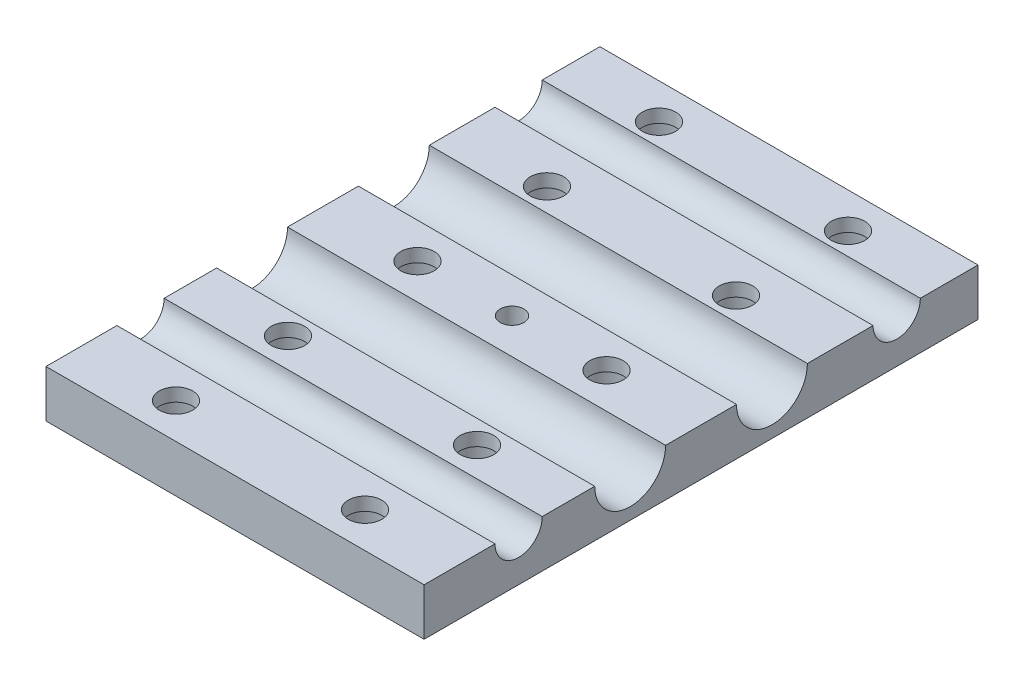
ISO-10303-21;
HEADER;
FILE_DESCRIPTION(('STEP AP214'),'2;1');
FILE_NAME('part.step','',(''),(''),'','','');
FILE_SCHEMA(('AUTOMOTIVE_DESIGN { 1 0 10303 214 1 1 1 1 }'));
ENDSEC;
DATA;
#1=APPLICATION_CONTEXT('core data for automotive mechanical design processes');
#2=APPLICATION_PROTOCOL_DEFINITION('international standard','automotive_design',2000,#1);
#3=PRODUCT_CONTEXT('',#1,'mechanical');
#4=PRODUCT('Part','Part','',(#3));
#5=PRODUCT_RELATED_PRODUCT_CATEGORY('part','',(#4));
#6=PRODUCT_DEFINITION_FORMATION('','',#4);
#7=PRODUCT_DEFINITION_CONTEXT('part definition',#1,'design');
#8=PRODUCT_DEFINITION('design','',#6,#7);
#9=PRODUCT_DEFINITION_SHAPE('','',#8);
#10=(LENGTH_UNIT() NAMED_UNIT(*) SI_UNIT(.MILLI.,.METRE.));
#11=(NAMED_UNIT(*) PLANE_ANGLE_UNIT() SI_UNIT($,.RADIAN.));
#12=(NAMED_UNIT(*) SI_UNIT($,.STERADIAN.) SOLID_ANGLE_UNIT());
#13=UNCERTAINTY_MEASURE_WITH_UNIT(LENGTH_MEASURE(1.E-05),#10,'distance_accuracy_value','');
#14=(GEOMETRIC_REPRESENTATION_CONTEXT(3) GLOBAL_UNCERTAINTY_ASSIGNED_CONTEXT((#13)) GLOBAL_UNIT_ASSIGNED_CONTEXT((#10,
#11,#12)) REPRESENTATION_CONTEXT('',''));
#15=CARTESIAN_POINT('',(0.,0.,0.));
#16=DIRECTION('',(0.,0.,1.));
#17=DIRECTION('',(1.,0.,0.));
#18=AXIS2_PLACEMENT_3D('',#15,#16,#17);
#19=CARTESIAN_POINT('',(-12.7000000000001,0.,32.4485));
#20=DIRECTION('',(0.,-1.,0.));
#21=DIRECTION('',(-1.,0.,0.));
#22=AXIS2_PLACEMENT_3D('',#19,#20,#21);
#23=CYLINDRICAL_SURFACE('',#22,2.2479);
#24=CARTESIAN_POINT('',(-12.7000000000001,6.34999999999991,32.4485));
#25=DIRECTION('',(0.,-1.,0.));
#26=DIRECTION('',(-1.,0.,0.));
#27=AXIS2_PLACEMENT_3D('',#24,#25,#26);
#28=CIRCLE('',#27,2.2479);
#29=CARTESIAN_POINT('',(-14.9479000000001,6.3499999999999,32.4485));
#30=VERTEX_POINT('',#29);
#31=EDGE_CURVE('E322',#30,#30,#28,.T.);
#32=ORIENTED_EDGE('',*,*,#31,.F.);
#33=EDGE_LOOP('',(#32));
#34=FACE_BOUND('',#33,.T.);
#35=CARTESIAN_POINT('',(-12.7000000000001,4.57199999999991,32.4485));
#36=DIRECTION('',(0.,-1.,0.));
#37=DIRECTION('',(-1.,0.,0.));
#38=AXIS2_PLACEMENT_3D('',#35,#36,#37);
#39=CIRCLE('',#38,2.2479);
#40=CARTESIAN_POINT('',(-14.9479000000001,4.5719999999999,32.4485));
#41=VERTEX_POINT('',#40);
#42=EDGE_CURVE('E43',#41,#41,#39,.F.);
#43=ORIENTED_EDGE('',*,*,#42,.F.);
#44=EDGE_LOOP('',(#43));
#45=FACE_BOUND('',#44,.T.);
#46=ADVANCED_FACE('F39',(#34,#45),#23,.F.);
#47=CARTESIAN_POINT('',(-12.7000000000001,0.,17.399));
#48=DIRECTION('',(0.,-1.,0.));
#49=DIRECTION('',(-1.,0.,0.));
#50=AXIS2_PLACEMENT_3D('',#47,#48,#49);
#51=CYLINDRICAL_SURFACE('',#50,2.2479);
#52=CARTESIAN_POINT('',(-12.7000000000001,6.34999999999991,17.399));
#53=DIRECTION('',(0.,-1.,0.));
#54=DIRECTION('',(-1.,0.,0.));
#55=AXIS2_PLACEMENT_3D('',#52,#53,#54);
#56=CIRCLE('',#55,2.2479);
#57=CARTESIAN_POINT('',(-14.9479000000001,6.3499999999999,17.3989999999999));
#58=VERTEX_POINT('',#57);
#59=EDGE_CURVE('E326',#58,#58,#56,.T.);
#60=ORIENTED_EDGE('',*,*,#59,.F.);
#61=EDGE_LOOP('',(#60));
#62=FACE_BOUND('',#61,.T.);
#63=CARTESIAN_POINT('',(-12.7000000000001,4.57199999999991,17.399));
#64=DIRECTION('',(0.,-1.,0.));
#65=DIRECTION('',(-1.,0.,0.));
#66=AXIS2_PLACEMENT_3D('',#63,#64,#65);
#67=CIRCLE('',#66,2.2479);
#68=CARTESIAN_POINT('',(-14.9479000000001,4.5719999999999,17.3989999999999));
#69=VERTEX_POINT('',#68);
#70=EDGE_CURVE('E251',#69,#69,#67,.F.);
#71=ORIENTED_EDGE('',*,*,#70,.F.);
#72=EDGE_LOOP('',(#71));
#73=FACE_BOUND('',#72,.T.);
#74=ADVANCED_FACE('F458',(#62,#73),#51,.F.);
#75=CARTESIAN_POINT('',(-12.7,0.,0.));
#76=DIRECTION('',(0.,-1.,0.));
#77=DIRECTION('',(-1.,0.,0.));
#78=AXIS2_PLACEMENT_3D('',#75,#76,#77);
#79=CYLINDRICAL_SURFACE('',#78,2.2479);
#80=CARTESIAN_POINT('',(-12.7,6.34999999999991,0.));
#81=DIRECTION('',(0.,-1.,0.));
#82=DIRECTION('',(-1.,0.,0.));
#83=AXIS2_PLACEMENT_3D('',#80,#81,#82);
#84=CIRCLE('',#83,2.2479);
#85=CARTESIAN_POINT('',(-14.9479,6.3499999999999,0.));
#86=VERTEX_POINT('',#85);
#87=EDGE_CURVE('E330',#86,#86,#84,.T.);
#88=ORIENTED_EDGE('',*,*,#87,.F.);
#89=EDGE_LOOP('',(#88));
#90=FACE_BOUND('',#89,.T.);
#91=CARTESIAN_POINT('',(-12.7,4.57199999999991,0.));
#92=DIRECTION('',(0.,-1.,0.));
#93=DIRECTION('',(-1.,0.,0.));
#94=AXIS2_PLACEMENT_3D('',#91,#92,#93);
#95=CIRCLE('',#94,2.2479);
#96=CARTESIAN_POINT('',(-14.9479,4.5719999999999,0.));
#97=VERTEX_POINT('',#96);
#98=EDGE_CURVE('E246',#97,#97,#95,.F.);
#99=ORIENTED_EDGE('',*,*,#98,.F.);
#100=EDGE_LOOP('',(#99));
#101=FACE_BOUND('',#100,.T.);
#102=ADVANCED_FACE('F464',(#90,#101),#79,.F.);
#103=CARTESIAN_POINT('',(-12.6999999999999,0.,-17.399));
#104=DIRECTION('',(0.,-1.,0.));
#105=DIRECTION('',(-1.,0.,0.));
#106=AXIS2_PLACEMENT_3D('',#103,#104,#105);
#107=CYLINDRICAL_SURFACE('',#106,2.2479);
#108=CARTESIAN_POINT('',(-12.7,6.34999999999991,-17.399));
#109=DIRECTION('',(0.,-1.,0.));
#110=DIRECTION('',(-1.,0.,0.));
#111=AXIS2_PLACEMENT_3D('',#108,#109,#110);
#112=CIRCLE('',#111,2.2479);
#113=CARTESIAN_POINT('',(-14.9479,6.3499999999999,-17.3990000000001));
#114=VERTEX_POINT('',#113);
#115=EDGE_CURVE('E334',#114,#114,#112,.T.);
#116=ORIENTED_EDGE('',*,*,#115,.F.);
#117=EDGE_LOOP('',(#116));
#118=FACE_BOUND('',#117,.T.);
#119=CARTESIAN_POINT('',(-12.7,4.57199999999991,-17.399));
#120=DIRECTION('',(0.,-1.,0.));
#121=DIRECTION('',(-1.,0.,0.));
#122=AXIS2_PLACEMENT_3D('',#119,#120,#121);
#123=CIRCLE('',#122,2.2479);
#124=CARTESIAN_POINT('',(-14.9479,4.5719999999999,-17.3990000000001));
#125=VERTEX_POINT('',#124);
#126=EDGE_CURVE('E240',#125,#125,#123,.F.);
#127=ORIENTED_EDGE('',*,*,#126,.F.);
#128=EDGE_LOOP('',(#127));
#129=FACE_BOUND('',#128,.T.);
#130=ADVANCED_FACE('F475',(#118,#129),#107,.F.);
#131=CARTESIAN_POINT('',(-12.6999999999999,0.,-32.4485));
#132=DIRECTION('',(0.,-1.,0.));
#133=DIRECTION('',(-1.,0.,0.));
#134=AXIS2_PLACEMENT_3D('',#131,#132,#133);
#135=CYLINDRICAL_SURFACE('',#134,2.2479);
#136=CARTESIAN_POINT('',(-12.6999999999999,6.34999999999991,-32.4485));
#137=DIRECTION('',(0.,-1.,0.));
#138=DIRECTION('',(-1.,0.,0.));
#139=AXIS2_PLACEMENT_3D('',#136,#137,#138);
#140=CIRCLE('',#139,2.2479);
#141=CARTESIAN_POINT('',(-14.9478999999999,6.3499999999999,-32.4485));
#142=VERTEX_POINT('',#141);
#143=EDGE_CURVE('E338',#142,#142,#140,.T.);
#144=ORIENTED_EDGE('',*,*,#143,.F.);
#145=EDGE_LOOP('',(#144));
#146=FACE_BOUND('',#145,.T.);
#147=CARTESIAN_POINT('',(-12.6999999999999,4.57199999999991,-32.4485));
#148=DIRECTION('',(0.,-1.,0.));
#149=DIRECTION('',(-1.,0.,0.));
#150=AXIS2_PLACEMENT_3D('',#147,#148,#149);
#151=CIRCLE('',#150,2.2479);
#152=CARTESIAN_POINT('',(-14.9478999999999,4.5719999999999,-32.4485));
#153=VERTEX_POINT('',#152);
#154=EDGE_CURVE('E234',#153,#153,#151,.F.);
#155=ORIENTED_EDGE('',*,*,#154,.F.);
#156=EDGE_LOOP('',(#155));
#157=FACE_BOUND('',#156,.T.);
#158=ADVANCED_FACE('F479',(#146,#157),#135,.F.);
#159=CARTESIAN_POINT('',(12.7000000000001,0.,-32.4485));
#160=DIRECTION('',(0.,-1.,0.));
#161=DIRECTION('',(-1.,0.,0.));
#162=AXIS2_PLACEMENT_3D('',#159,#160,#161);
#163=CYLINDRICAL_SURFACE('',#162,2.2479);
#164=CARTESIAN_POINT('',(12.7000000000001,6.35000000000009,-32.4485));
#165=DIRECTION('',(0.,-1.,0.));
#166=DIRECTION('',(-1.,0.,0.));
#167=AXIS2_PLACEMENT_3D('',#164,#165,#166);
#168=CIRCLE('',#167,2.2479);
#169=CARTESIAN_POINT('',(10.4521000000001,6.35000000000007,-32.4485));
#170=VERTEX_POINT('',#169);
#171=EDGE_CURVE('E342',#170,#170,#168,.T.);
#172=ORIENTED_EDGE('',*,*,#171,.F.);
#173=EDGE_LOOP('',(#172));
#174=FACE_BOUND('',#173,.T.);
#175=CARTESIAN_POINT('',(12.7000000000001,4.57200000000009,-32.4485));
#176=DIRECTION('',(0.,-1.,0.));
#177=DIRECTION('',(-1.,0.,0.));
#178=AXIS2_PLACEMENT_3D('',#175,#176,#177);
#179=CIRCLE('',#178,2.2479);
#180=CARTESIAN_POINT('',(10.4521000000001,4.57200000000007,-32.4485));
#181=VERTEX_POINT('',#180);
#182=EDGE_CURVE('E228',#181,#181,#179,.F.);
#183=ORIENTED_EDGE('',*,*,#182,.F.);
#184=EDGE_LOOP('',(#183));
#185=FACE_BOUND('',#184,.T.);
#186=ADVANCED_FACE('F483',(#174,#185),#163,.F.);
#187=CARTESIAN_POINT('',(12.7000000000001,0.,-17.399));
#188=DIRECTION('',(0.,-1.,0.));
#189=DIRECTION('',(-1.,0.,0.));
#190=AXIS2_PLACEMENT_3D('',#187,#188,#189);
#191=CYLINDRICAL_SURFACE('',#190,2.2479);
#192=CARTESIAN_POINT('',(12.7,6.35000000000009,-17.399));
#193=DIRECTION('',(0.,-1.,0.));
#194=DIRECTION('',(-1.,0.,0.));
#195=AXIS2_PLACEMENT_3D('',#192,#193,#194);
#196=CIRCLE('',#195,2.2479);
#197=CARTESIAN_POINT('',(10.4521,6.35000000000007,-17.399));
#198=VERTEX_POINT('',#197);
#199=EDGE_CURVE('E346',#198,#198,#196,.T.);
#200=ORIENTED_EDGE('',*,*,#199,.F.);
#201=EDGE_LOOP('',(#200));
#202=FACE_BOUND('',#201,.T.);
#203=CARTESIAN_POINT('',(12.7,4.57200000000009,-17.399));
#204=DIRECTION('',(0.,-1.,0.));
#205=DIRECTION('',(-1.,0.,0.));
#206=AXIS2_PLACEMENT_3D('',#203,#204,#205);
#207=CIRCLE('',#206,2.2479);
#208=CARTESIAN_POINT('',(10.4521,4.57200000000007,-17.399));
#209=VERTEX_POINT('',#208);
#210=EDGE_CURVE('E222',#209,#209,#207,.F.);
#211=ORIENTED_EDGE('',*,*,#210,.F.);
#212=EDGE_LOOP('',(#211));
#213=FACE_BOUND('',#212,.T.);
#214=ADVANCED_FACE('F487',(#202,#213),#191,.F.);
#215=CARTESIAN_POINT('',(12.7,0.,0.));
#216=DIRECTION('',(0.,-1.,0.));
#217=DIRECTION('',(-1.,0.,0.));
#218=AXIS2_PLACEMENT_3D('',#215,#216,#217);
#219=CYLINDRICAL_SURFACE('',#218,2.2479);
#220=CARTESIAN_POINT('',(12.7,6.35000000000009,0.));
#221=DIRECTION('',(0.,-1.,0.));
#222=DIRECTION('',(-1.,0.,0.));
#223=AXIS2_PLACEMENT_3D('',#220,#221,#222);
#224=CIRCLE('',#223,2.2479);
#225=CARTESIAN_POINT('',(10.4521,6.35000000000007,0.));
#226=VERTEX_POINT('',#225);
#227=EDGE_CURVE('E350',#226,#226,#224,.T.);
#228=ORIENTED_EDGE('',*,*,#227,.F.);
#229=EDGE_LOOP('',(#228));
#230=FACE_BOUND('',#229,.T.);
#231=CARTESIAN_POINT('',(12.7,4.57200000000009,0.));
#232=DIRECTION('',(0.,-1.,0.));
#233=DIRECTION('',(-1.,0.,0.));
#234=AXIS2_PLACEMENT_3D('',#231,#232,#233);
#235=CIRCLE('',#234,2.2479);
#236=CARTESIAN_POINT('',(10.4521,4.57200000000007,0.));
#237=VERTEX_POINT('',#236);
#238=EDGE_CURVE('E216',#237,#237,#235,.F.);
#239=ORIENTED_EDGE('',*,*,#238,.F.);
#240=EDGE_LOOP('',(#239));
#241=FACE_BOUND('',#240,.T.);
#242=ADVANCED_FACE('F491',(#230,#241),#219,.F.);
#243=CARTESIAN_POINT('',(12.6999999999999,0.,17.399));
#244=DIRECTION('',(0.,-1.,0.));
#245=DIRECTION('',(-1.,0.,0.));
#246=AXIS2_PLACEMENT_3D('',#243,#244,#245);
#247=CYLINDRICAL_SURFACE('',#246,2.2479);
#248=CARTESIAN_POINT('',(12.6999999999999,6.35000000000009,17.399));
#249=DIRECTION('',(0.,-1.,0.));
#250=DIRECTION('',(-1.,0.,0.));
#251=AXIS2_PLACEMENT_3D('',#248,#249,#250);
#252=CIRCLE('',#251,2.2479);
#253=CARTESIAN_POINT('',(10.4520999999999,6.35000000000007,17.399));
#254=VERTEX_POINT('',#253);
#255=EDGE_CURVE('E354',#254,#254,#252,.T.);
#256=ORIENTED_EDGE('',*,*,#255,.F.);
#257=EDGE_LOOP('',(#256));
#258=FACE_BOUND('',#257,.T.);
#259=CARTESIAN_POINT('',(12.6999999999999,4.57200000000009,17.399));
#260=DIRECTION('',(0.,-1.,0.));
#261=DIRECTION('',(-1.,0.,0.));
#262=AXIS2_PLACEMENT_3D('',#259,#260,#261);
#263=CIRCLE('',#262,2.2479);
#264=CARTESIAN_POINT('',(10.4520999999999,4.57200000000007,17.399));
#265=VERTEX_POINT('',#264);
#266=EDGE_CURVE('E210',#265,#265,#263,.F.);
#267=ORIENTED_EDGE('',*,*,#266,.F.);
#268=EDGE_LOOP('',(#267));
#269=FACE_BOUND('',#268,.T.);
#270=ADVANCED_FACE('F495',(#258,#269),#247,.F.);
#271=CARTESIAN_POINT('',(12.6999999999999,0.,32.4485));
#272=DIRECTION('',(0.,-1.,0.));
#273=DIRECTION('',(-1.,0.,0.));
#274=AXIS2_PLACEMENT_3D('',#271,#272,#273);
#275=CYLINDRICAL_SURFACE('',#274,2.2479);
#276=CARTESIAN_POINT('',(12.6999999999998,6.35000000000009,32.4485));
#277=DIRECTION('',(0.,-1.,0.));
#278=DIRECTION('',(-1.,0.,0.));
#279=AXIS2_PLACEMENT_3D('',#276,#277,#278);
#280=CIRCLE('',#279,2.2479);
#281=CARTESIAN_POINT('',(10.4520999999999,6.35000000000007,32.4485));
#282=VERTEX_POINT('',#281);
#283=EDGE_CURVE('E208',#282,#282,#280,.T.);
#284=ORIENTED_EDGE('',*,*,#283,.F.);
#285=EDGE_LOOP('',(#284));
#286=FACE_BOUND('',#285,.T.);
#287=CARTESIAN_POINT('',(12.6999999999999,4.57200000000009,32.4485));
#288=DIRECTION('',(0.,-1.,0.));
#289=DIRECTION('',(-1.,0.,0.));
#290=AXIS2_PLACEMENT_3D('',#287,#288,#289);
#291=CIRCLE('',#290,2.2479);
#292=CARTESIAN_POINT('',(10.4520999999999,4.57200000000007,32.4485));
#293=VERTEX_POINT('',#292);
#294=EDGE_CURVE('E204',#293,#293,#291,.F.);
#295=ORIENTED_EDGE('',*,*,#294,.F.);
#296=EDGE_LOOP('',(#295));
#297=FACE_BOUND('',#296,.T.);
#298=ADVANCED_FACE('F470',(#286,#297),#275,.F.);
#299=CARTESIAN_POINT('',(0.,6.35,0.));
#300=DIRECTION('',(0.,-1.,0.));
#301=DIRECTION('',(-1.,0.,0.));
#302=AXIS2_PLACEMENT_3D('',#299,#300,#301);
#303=PLANE('',#302);
#304=CARTESIAN_POINT('',(0.,6.35,0.));
#305=DIRECTION('',(0.,-1.,0.));
#306=DIRECTION('',(-1.,0.,0.));
#307=AXIS2_PLACEMENT_3D('',#304,#305,#306);
#308=CIRCLE('',#307,1.5875);
#309=CARTESIAN_POINT('',(-1.58750000000004,6.34999999999999,0.));
#310=VERTEX_POINT('',#309);
#311=EDGE_CURVE('E893',#310,#310,#308,.T.);
#312=ORIENTED_EDGE('',*,*,#311,.T.);
#313=EDGE_LOOP('',(#312));
#314=FACE_BOUND('',#313,.T.);
#315=ORIENTED_EDGE('',*,*,#87,.T.);
#316=EDGE_LOOP('',(#315));
#317=FACE_BOUND('',#316,.T.);
#318=ORIENTED_EDGE('',*,*,#227,.T.);
#319=EDGE_LOOP('',(#318));
#320=FACE_BOUND('',#319,.T.);
#321=DIRECTION('',(0.,0.,1.));
#322=VECTOR('',#321,1.);
#323=CARTESIAN_POINT('',(25.3999999999998,6.35000000000018,37.2110000000001));
#324=LINE('',#323,#322);
#325=CARTESIAN_POINT('',(25.4,6.35000000000018,-4.76249999999991));
#326=VERTEX_POINT('',#325);
#327=CARTESIAN_POINT('',(25.3999999999999,6.35000000000018,4.76250000000009));
#328=VERTEX_POINT('',#327);
#329=EDGE_CURVE('E156',#326,#328,#324,.T.);
#330=ORIENTED_EDGE('',*,*,#329,.F.);
#331=DIRECTION('',(-1.,0.,0.));
#332=VECTOR('',#331,1.);
#333=CARTESIAN_POINT('',(25.4,6.35000000000018,-4.76249999999991));
#334=LINE('',#333,#332);
#335=CARTESIAN_POINT('',(-25.4,6.34999999999982,-4.76250000000009));
#336=VERTEX_POINT('',#335);
#337=EDGE_CURVE('E57',#326,#336,#334,.T.);
#338=ORIENTED_EDGE('',*,*,#337,.T.);
#339=DIRECTION('',(0.,0.,-1.));
#340=VECTOR('',#339,1.);
#341=CARTESIAN_POINT('',(-25.4000000000002,6.34999999999982,37.2109999999999));
#342=LINE('',#341,#340);
#343=CARTESIAN_POINT('',(-25.4000000000001,6.34999999999982,4.76249999999991));
#344=VERTEX_POINT('',#343);
#345=EDGE_CURVE('E426',#344,#336,#342,.T.);
#346=ORIENTED_EDGE('',*,*,#345,.F.);
#347=DIRECTION('',(-1.,0.,0.));
#348=VECTOR('',#347,1.);
#349=CARTESIAN_POINT('',(25.3999999999999,6.35000000000018,4.76250000000009));
#350=LINE('',#349,#348);
#351=EDGE_CURVE('E365',#344,#328,#350,.F.);
#352=ORIENTED_EDGE('',*,*,#351,.T.);
#353=EDGE_LOOP('',(#330,#338,#346,#352));
#354=FACE_BOUND('',#353,.T.);
#355=ADVANCED_FACE('F452',(#314,#317,#320,#354),#303,.F.);
#356=ORIENTED_EDGE('',*,*,#59,.T.);
#357=EDGE_LOOP('',(#356));
#358=FACE_BOUND('',#357,.T.);
#359=ORIENTED_EDGE('',*,*,#255,.T.);
#360=EDGE_LOOP('',(#359));
#361=FACE_BOUND('',#360,.T.);
#362=CARTESIAN_POINT('',(25.3999999999999,6.35000000000018,14.2875000000001));
#363=VERTEX_POINT('',#362);
#364=CARTESIAN_POINT('',(25.3999999999999,6.35000000000018,21.3360000000001));
#365=VERTEX_POINT('',#364);
#366=EDGE_CURVE('E159',#363,#365,#324,.T.);
#367=ORIENTED_EDGE('',*,*,#366,.F.);
#368=DIRECTION('',(-1.,0.,0.));
#369=VECTOR('',#368,1.);
#370=CARTESIAN_POINT('',(25.3999999999999,6.35000000000018,14.2875000000001));
#371=LINE('',#370,#369);
#372=CARTESIAN_POINT('',(-25.4000000000001,6.34999999999982,14.2874999999999));
#373=VERTEX_POINT('',#372);
#374=EDGE_CURVE('E65',#363,#373,#371,.T.);
#375=ORIENTED_EDGE('',*,*,#374,.T.);
#376=CARTESIAN_POINT('',(-25.4000000000001,6.34999999999982,21.3359999999999));
#377=VERTEX_POINT('',#376);
#378=EDGE_CURVE('E189',#377,#373,#342,.T.);
#379=ORIENTED_EDGE('',*,*,#378,.F.);
#380=DIRECTION('',(-1.,0.,0.));
#381=VECTOR('',#380,1.);
#382=CARTESIAN_POINT('',(25.3999999999999,6.35000000000018,21.3360000000001));
#383=LINE('',#382,#381);
#384=EDGE_CURVE('E178',#377,#365,#383,.F.);
#385=ORIENTED_EDGE('',*,*,#384,.T.);
#386=EDGE_LOOP('',(#367,#375,#379,#385));
#387=FACE_BOUND('',#386,.T.);
#388=ADVANCED_FACE('F187',(#358,#361,#387),#303,.F.);
#389=ORIENTED_EDGE('',*,*,#115,.T.);
#390=EDGE_LOOP('',(#389));
#391=FACE_BOUND('',#390,.T.);
#392=ORIENTED_EDGE('',*,*,#199,.T.);
#393=EDGE_LOOP('',(#392));
#394=FACE_BOUND('',#393,.T.);
#395=CARTESIAN_POINT('',(-25.4,6.34999999999982,-14.2875000000001));
#396=VERTEX_POINT('',#395);
#397=CARTESIAN_POINT('',(-25.4,6.34999999999982,-23.1140000000001));
#398=VERTEX_POINT('',#397);
#399=EDGE_CURVE('E147',#396,#398,#342,.T.);
#400=ORIENTED_EDGE('',*,*,#399,.F.);
#401=DIRECTION('',(-1.,0.,0.));
#402=VECTOR('',#401,1.);
#403=CARTESIAN_POINT('',(25.4,6.35000000000018,-14.2874999999999));
#404=LINE('',#403,#402);
#405=CARTESIAN_POINT('',(25.4,6.35000000000018,-14.2874999999999));
#406=VERTEX_POINT('',#405);
#407=EDGE_CURVE('E134',#396,#406,#404,.F.);
#408=ORIENTED_EDGE('',*,*,#407,.T.);
#409=CARTESIAN_POINT('',(25.4,6.35000000000018,-23.1139999999999));
#410=VERTEX_POINT('',#409);
#411=EDGE_CURVE('E146',#410,#406,#324,.T.);
#412=ORIENTED_EDGE('',*,*,#411,.F.);
#413=DIRECTION('',(-1.,0.,0.));
#414=VECTOR('',#413,1.);
#415=CARTESIAN_POINT('',(25.4,6.35000000000018,-23.1139999999999));
#416=LINE('',#415,#414);
#417=EDGE_CURVE('E11',#410,#398,#416,.T.);
#418=ORIENTED_EDGE('',*,*,#417,.T.);
#419=EDGE_LOOP('',(#400,#408,#412,#418));
#420=FACE_BOUND('',#419,.T.);
#421=ADVANCED_FACE('F145',(#391,#394,#420),#303,.F.);
#422=ORIENTED_EDGE('',*,*,#283,.T.);
#423=EDGE_LOOP('',(#422));
#424=FACE_BOUND('',#423,.T.);
#425=ORIENTED_EDGE('',*,*,#31,.T.);
#426=EDGE_LOOP('',(#425));
#427=FACE_BOUND('',#426,.T.);
#428=CARTESIAN_POINT('',(25.3999999999999,6.35000000000018,27.6860000000001));
#429=VERTEX_POINT('',#428);
#430=CARTESIAN_POINT('',(25.3999999999998,6.35000000000018,37.2110000000001));
#431=VERTEX_POINT('',#430);
#432=EDGE_CURVE('E158',#429,#431,#324,.T.);
#433=ORIENTED_EDGE('',*,*,#432,.F.);
#434=DIRECTION('',(-1.,0.,0.));
#435=VECTOR('',#434,1.);
#436=CARTESIAN_POINT('',(25.3999999999999,6.35000000000018,27.6860000000001));
#437=LINE('',#436,#435);
#438=CARTESIAN_POINT('',(-25.4000000000001,6.34999999999982,27.6859999999999));
#439=VERTEX_POINT('',#438);
#440=EDGE_CURVE('E181',#429,#439,#437,.T.);
#441=ORIENTED_EDGE('',*,*,#440,.T.);
#442=CARTESIAN_POINT('',(-25.4000000000002,6.34999999999982,37.2109999999999));
#443=VERTEX_POINT('',#442);
#444=EDGE_CURVE('E398',#443,#439,#342,.T.);
#445=ORIENTED_EDGE('',*,*,#444,.F.);
#446=DIRECTION('',(-1.,0.,0.));
#447=VECTOR('',#446,1.);
#448=CARTESIAN_POINT('',(25.3999999999998,6.35000000000018,37.2110000000001));
#449=LINE('',#448,#447);
#450=EDGE_CURVE('E183',#431,#443,#449,.T.);
#451=ORIENTED_EDGE('',*,*,#450,.F.);
#452=EDGE_LOOP('',(#433,#441,#445,#451));
#453=FACE_BOUND('',#452,.T.);
#454=ADVANCED_FACE('F433',(#424,#427,#453),#303,.F.);
#455=CARTESIAN_POINT('',(25.3999999999999,1.76941794549634E-13,37.2110000000001));
#456=DIRECTION('',(0.,0.,-1.));
#457=DIRECTION('',(1.,0.,0.));
#458=AXIS2_PLACEMENT_3D('',#455,#456,#457);
#459=PLANE('',#458);
#460=ORIENTED_EDGE('',*,*,#450,.T.);
#461=DIRECTION('',(0.,1.,0.));
#462=VECTOR('',#461,1.);
#463=CARTESIAN_POINT('',(-25.4000000000001,-1.76941794549634E-13,37.2109999999999));
#464=LINE('',#463,#462);
#465=CARTESIAN_POINT('',(-25.4000000000001,-1.76941794549634E-13,37.2109999999999));
#466=VERTEX_POINT('',#465);
#467=EDGE_CURVE('E191',#466,#443,#464,.T.);
#468=ORIENTED_EDGE('',*,*,#467,.F.);
#469=DIRECTION('',(-1.,0.,0.));
#470=VECTOR('',#469,1.);
#471=CARTESIAN_POINT('',(25.3999999999999,1.76941794549634E-13,37.2110000000001));
#472=LINE('',#471,#470);
#473=CARTESIAN_POINT('',(25.3999999999999,1.76941794549634E-13,37.2110000000001));
#474=VERTEX_POINT('',#473);
#475=EDGE_CURVE('E162',#474,#466,#472,.T.);
#476=ORIENTED_EDGE('',*,*,#475,.F.);
#477=DIRECTION('',(0.,1.,0.));
#478=VECTOR('',#477,1.);
#479=CARTESIAN_POINT('',(25.3999999999999,1.76941794549634E-13,37.2110000000001));
#480=LINE('',#479,#478);
#481=EDGE_CURVE('E393',#474,#431,#480,.T.);
#482=ORIENTED_EDGE('',*,*,#481,.T.);
#483=EDGE_LOOP('',(#460,#468,#476,#482));
#484=FACE_BOUND('',#483,.T.);
#485=ADVANCED_FACE('F41',(#484),#459,.F.);
#486=CARTESIAN_POINT('',(-25.4000000000001,-1.76941794549634E-13,37.2109999999999));
#487=DIRECTION('',(1.,0.,0.));
#488=DIRECTION('',(0.,0.,1.));
#489=AXIS2_PLACEMENT_3D('',#486,#487,#488);
#490=PLANE('',#489);
#491=ORIENTED_EDGE('',*,*,#345,.T.);
#492=CARTESIAN_POINT('',(-25.4,6.34999999999982,-9.52500000000009));
#493=DIRECTION('',(-1.,0.,0.));
#494=DIRECTION('',(0.,0.,-1.));
#495=AXIS2_PLACEMENT_3D('',#492,#493,#494);
#496=CIRCLE('',#495,4.7625);
#497=EDGE_CURVE('E140',#396,#336,#496,.T.);
#498=ORIENTED_EDGE('',*,*,#497,.F.);
#499=ORIENTED_EDGE('',*,*,#399,.T.);
#500=CARTESIAN_POINT('',(-25.3999999999999,6.34999999999982,-26.2890000000001));
#501=DIRECTION('',(-1.,0.,0.));
#502=DIRECTION('',(0.,0.,-1.));
#503=AXIS2_PLACEMENT_3D('',#500,#501,#502);
#504=CIRCLE('',#503,3.175);
#505=CARTESIAN_POINT('',(-25.3999999999999,6.34999999999982,-29.4640000000001));
#506=VERTEX_POINT('',#505);
#507=EDGE_CURVE('E373',#506,#398,#504,.T.);
#508=ORIENTED_EDGE('',*,*,#507,.F.);
#509=CARTESIAN_POINT('',(-25.3999999999999,6.34999999999982,-37.2110000000001));
#510=VERTEX_POINT('',#509);
#511=EDGE_CURVE('E397',#506,#510,#342,.T.);
#512=ORIENTED_EDGE('',*,*,#511,.T.);
#513=DIRECTION('',(0.,1.,0.));
#514=VECTOR('',#513,1.);
#515=CARTESIAN_POINT('',(-25.3999999999999,-1.76941794549634E-13,-37.2110000000001));
#516=LINE('',#515,#514);
#517=CARTESIAN_POINT('',(-25.3999999999999,-1.76941794549634E-13,-37.2110000000001));
#518=VERTEX_POINT('',#517);
#519=EDGE_CURVE('E197',#518,#510,#516,.T.);
#520=ORIENTED_EDGE('',*,*,#519,.F.);
#521=DIRECTION('',(0.,0.,-1.));
#522=VECTOR('',#521,1.);
#523=CARTESIAN_POINT('',(-25.4000000000001,-1.76941794549634E-13,37.2109999999999));
#524=LINE('',#523,#522);
#525=EDGE_CURVE('E384',#466,#518,#524,.T.);
#526=ORIENTED_EDGE('',*,*,#525,.F.);
#527=ORIENTED_EDGE('',*,*,#467,.T.);
#528=ORIENTED_EDGE('',*,*,#444,.T.);
#529=CARTESIAN_POINT('',(-25.4000000000001,6.34999999999982,24.5109999999999));
#530=DIRECTION('',(-1.,0.,0.));
#531=DIRECTION('',(0.,0.,-1.));
#532=AXIS2_PLACEMENT_3D('',#529,#530,#531);
#533=CIRCLE('',#532,3.175);
#534=EDGE_CURVE('E184',#377,#439,#533,.T.);
#535=ORIENTED_EDGE('',*,*,#534,.F.);
#536=ORIENTED_EDGE('',*,*,#378,.T.);
#537=CARTESIAN_POINT('',(-25.4000000000001,6.34999999999982,9.52499999999991));
#538=DIRECTION('',(-1.,0.,0.));
#539=DIRECTION('',(0.,0.,-1.));
#540=AXIS2_PLACEMENT_3D('',#537,#538,#539);
#541=CIRCLE('',#540,4.7625);
#542=EDGE_CURVE('E362',#344,#373,#541,.T.);
#543=ORIENTED_EDGE('',*,*,#542,.F.);
#544=EDGE_LOOP('',(#491,#498,#499,#508,#512,#520,#526,#527,#528,#535,#536,#543));
#545=FACE_BOUND('',#544,.T.);
#546=ADVANCED_FACE('F424',(#545),#490,.F.);
#547=CARTESIAN_POINT('',(25.4000000000001,1.76941794549634E-13,-37.2109999999999));
#548=DIRECTION('',(0.,0.,1.));
#549=DIRECTION('',(-1.,0.,0.));
#550=AXIS2_PLACEMENT_3D('',#547,#548,#549);
#551=PLANE('',#550);
#552=DIRECTION('',(1.,0.,0.));
#553=VECTOR('',#552,1.);
#554=CARTESIAN_POINT('',(25.4000000000001,6.35000000000018,-37.2109999999999));
#555=LINE('',#554,#553);
#556=CARTESIAN_POINT('',(25.4000000000001,6.35000000000018,-37.2109999999999));
#557=VERTEX_POINT('',#556);
#558=EDGE_CURVE('E166',#510,#557,#555,.T.);
#559=ORIENTED_EDGE('',*,*,#558,.T.);
#560=DIRECTION('',(0.,1.,0.));
#561=VECTOR('',#560,1.);
#562=CARTESIAN_POINT('',(25.4000000000001,1.76941794549634E-13,-37.2109999999999));
#563=LINE('',#562,#561);
#564=CARTESIAN_POINT('',(25.4000000000001,1.76941794549634E-13,-37.2109999999999));
#565=VERTEX_POINT('',#564);
#566=EDGE_CURVE('E409',#565,#557,#563,.T.);
#567=ORIENTED_EDGE('',*,*,#566,.F.);
#568=DIRECTION('',(1.,0.,0.));
#569=VECTOR('',#568,1.);
#570=CARTESIAN_POINT('',(25.4000000000001,1.76941794549634E-13,-37.2109999999999));
#571=LINE('',#570,#569);
#572=EDGE_CURVE('E387',#518,#565,#571,.T.);
#573=ORIENTED_EDGE('',*,*,#572,.F.);
#574=ORIENTED_EDGE('',*,*,#519,.T.);
#575=EDGE_LOOP('',(#559,#567,#573,#574));
#576=FACE_BOUND('',#575,.T.);
#577=ADVANCED_FACE('F407',(#576),#551,.F.);
#578=CARTESIAN_POINT('',(25.3999999999999,1.76941794549634E-13,37.2110000000001));
#579=DIRECTION('',(-1.,0.,0.));
#580=DIRECTION('',(0.,0.,-1.));
#581=AXIS2_PLACEMENT_3D('',#578,#579,#580);
#582=PLANE('',#581);
#583=ORIENTED_EDGE('',*,*,#411,.T.);
#584=CARTESIAN_POINT('',(25.4,6.35000000000018,-9.52499999999991));
#585=DIRECTION('',(-1.,0.,0.));
#586=DIRECTION('',(0.,0.,-1.));
#587=AXIS2_PLACEMENT_3D('',#584,#585,#586);
#588=CIRCLE('',#587,4.7625);
#589=EDGE_CURVE('E131',#406,#326,#588,.T.);
#590=ORIENTED_EDGE('',*,*,#589,.T.);
#591=ORIENTED_EDGE('',*,*,#329,.T.);
#592=CARTESIAN_POINT('',(25.3999999999999,6.35000000000018,9.52500000000009));
#593=DIRECTION('',(-1.,0.,0.));
#594=DIRECTION('',(0.,0.,-1.));
#595=AXIS2_PLACEMENT_3D('',#592,#593,#594);
#596=CIRCLE('',#595,4.7625);
#597=EDGE_CURVE('E173',#328,#363,#596,.T.);
#598=ORIENTED_EDGE('',*,*,#597,.T.);
#599=ORIENTED_EDGE('',*,*,#366,.T.);
#600=CARTESIAN_POINT('',(25.3999999999999,6.35000000000018,24.5110000000001));
#601=DIRECTION('',(-1.,0.,0.));
#602=DIRECTION('',(0.,0.,-1.));
#603=AXIS2_PLACEMENT_3D('',#600,#601,#602);
#604=CIRCLE('',#603,3.175);
#605=EDGE_CURVE('E171',#365,#429,#604,.T.);
#606=ORIENTED_EDGE('',*,*,#605,.T.);
#607=ORIENTED_EDGE('',*,*,#432,.T.);
#608=ORIENTED_EDGE('',*,*,#481,.F.);
#609=DIRECTION('',(0.,0.,1.));
#610=VECTOR('',#609,1.);
#611=CARTESIAN_POINT('',(25.3999999999999,1.76941794549634E-13,37.2110000000001));
#612=LINE('',#611,#610);
#613=EDGE_CURVE('E390',#565,#474,#612,.T.);
#614=ORIENTED_EDGE('',*,*,#613,.F.);
#615=ORIENTED_EDGE('',*,*,#566,.T.);
#616=CARTESIAN_POINT('',(25.4000000000001,6.35000000000018,-29.4639999999999));
#617=VERTEX_POINT('',#616);
#618=EDGE_CURVE('E155',#557,#617,#324,.T.);
#619=ORIENTED_EDGE('',*,*,#618,.T.);
#620=CARTESIAN_POINT('',(25.4000000000001,6.35000000000018,-26.2889999999999));
#621=DIRECTION('',(-1.,0.,0.));
#622=DIRECTION('',(0.,0.,-1.));
#623=AXIS2_PLACEMENT_3D('',#620,#621,#622);
#624=CIRCLE('',#623,3.175);
#625=EDGE_CURVE('E153',#617,#410,#624,.T.);
#626=ORIENTED_EDGE('',*,*,#625,.T.);
#627=EDGE_LOOP('',(#583,#590,#591,#598,#599,#606,#607,#608,#614,#615,#619,#626));
#628=FACE_BOUND('',#627,.T.);
#629=ADVANCED_FACE('F151',(#628),#582,.F.);
#630=CARTESIAN_POINT('',(0.,0.,0.));
#631=DIRECTION('',(0.,-1.,0.));
#632=DIRECTION('',(-1.,0.,0.));
#633=AXIS2_PLACEMENT_3D('',#630,#631,#632);
#634=PLANE('',#633);
#635=CARTESIAN_POINT('',(0.,0.,0.));
#636=DIRECTION('',(0.,-1.,0.));
#637=DIRECTION('',(-1.,0.,0.));
#638=AXIS2_PLACEMENT_3D('',#635,#636,#637);
#639=CIRCLE('',#638,1.5875);
#640=CARTESIAN_POINT('',(-1.58749999999999,0.,0.));
#641=VERTEX_POINT('',#640);
#642=EDGE_CURVE('E905',#641,#641,#639,.T.);
#643=ORIENTED_EDGE('',*,*,#642,.F.);
#644=EDGE_LOOP('',(#643));
#645=FACE_BOUND('',#644,.T.);
#646=CARTESIAN_POINT('',(-12.7000000000001,0.,32.4485));
#647=DIRECTION('',(0.,-1.,0.));
#648=DIRECTION('',(-1.,0.,0.));
#649=AXIS2_PLACEMENT_3D('',#646,#647,#648);
#650=CIRCLE('',#649,3.429);
#651=CARTESIAN_POINT('',(-16.1290000000001,-1.12415476296603E-13,32.4485));
#652=VERTEX_POINT('',#651);
#653=EDGE_CURVE('E271',#652,#652,#650,.T.);
#654=ORIENTED_EDGE('',*,*,#653,.F.);
#655=EDGE_LOOP('',(#654));
#656=FACE_BOUND('',#655,.T.);
#657=CARTESIAN_POINT('',(-12.7000000000001,0.,17.399));
#658=DIRECTION('',(0.,-1.,0.));
#659=DIRECTION('',(-1.,0.,0.));
#660=AXIS2_PLACEMENT_3D('',#657,#658,#659);
#661=CIRCLE('',#660,3.429);
#662=CARTESIAN_POINT('',(-16.1290000000001,-1.12415476296603E-13,17.3989999999999));
#663=VERTEX_POINT('',#662);
#664=EDGE_CURVE('E263',#663,#663,#661,.T.);
#665=ORIENTED_EDGE('',*,*,#664,.F.);
#666=EDGE_LOOP('',(#665));
#667=FACE_BOUND('',#666,.T.);
#668=CARTESIAN_POINT('',(-12.7,0.,0.));
#669=DIRECTION('',(0.,-1.,0.));
#670=DIRECTION('',(-1.,0.,0.));
#671=AXIS2_PLACEMENT_3D('',#668,#669,#670);
#672=CIRCLE('',#671,3.429);
#673=CARTESIAN_POINT('',(-16.129,-1.12415476296603E-13,0.));
#674=VERTEX_POINT('',#673);
#675=EDGE_CURVE('E254',#674,#674,#672,.T.);
#676=ORIENTED_EDGE('',*,*,#675,.F.);
#677=EDGE_LOOP('',(#676));
#678=FACE_BOUND('',#677,.T.);
#679=CARTESIAN_POINT('',(-12.6999999999999,0.,-17.399));
#680=DIRECTION('',(0.,-1.,0.));
#681=DIRECTION('',(-1.,0.,0.));
#682=AXIS2_PLACEMENT_3D('',#679,#680,#681);
#683=CIRCLE('',#682,3.429);
#684=CARTESIAN_POINT('',(-16.1289999999999,-1.12415476296603E-13,-17.3990000000001));
#685=VERTEX_POINT('',#684);
#686=EDGE_CURVE('E249',#685,#685,#683,.T.);
#687=ORIENTED_EDGE('',*,*,#686,.F.);
#688=EDGE_LOOP('',(#687));
#689=FACE_BOUND('',#688,.T.);
#690=CARTESIAN_POINT('',(-12.6999999999999,0.,-32.4485));
#691=DIRECTION('',(0.,-1.,0.));
#692=DIRECTION('',(-1.,0.,0.));
#693=AXIS2_PLACEMENT_3D('',#690,#691,#692);
#694=CIRCLE('',#693,3.429);
#695=CARTESIAN_POINT('',(-16.1289999999999,-1.12415476296603E-13,-32.4485));
#696=VERTEX_POINT('',#695);
#697=EDGE_CURVE('E244',#696,#696,#694,.T.);
#698=ORIENTED_EDGE('',*,*,#697,.F.);
#699=EDGE_LOOP('',(#698));
#700=FACE_BOUND('',#699,.T.);
#701=CARTESIAN_POINT('',(12.7000000000001,0.,-32.4485));
#702=DIRECTION('',(0.,-1.,0.));
#703=DIRECTION('',(-1.,0.,0.));
#704=AXIS2_PLACEMENT_3D('',#701,#702,#703);
#705=CIRCLE('',#704,3.429);
#706=CARTESIAN_POINT('',(9.27100000000012,0.,-32.4485));
#707=VERTEX_POINT('',#706);
#708=EDGE_CURVE('E238',#707,#707,#705,.T.);
#709=ORIENTED_EDGE('',*,*,#708,.F.);
#710=EDGE_LOOP('',(#709));
#711=FACE_BOUND('',#710,.T.);
#712=CARTESIAN_POINT('',(12.7000000000001,0.,-17.399));
#713=DIRECTION('',(0.,-1.,0.));
#714=DIRECTION('',(-1.,0.,0.));
#715=AXIS2_PLACEMENT_3D('',#712,#713,#714);
#716=CIRCLE('',#715,3.429);
#717=CARTESIAN_POINT('',(9.27100000000006,0.,-17.399));
#718=VERTEX_POINT('',#717);
#719=EDGE_CURVE('E232',#718,#718,#716,.T.);
#720=ORIENTED_EDGE('',*,*,#719,.F.);
#721=EDGE_LOOP('',(#720));
#722=FACE_BOUND('',#721,.T.);
#723=CARTESIAN_POINT('',(12.7,0.,0.));
#724=DIRECTION('',(0.,-1.,0.));
#725=DIRECTION('',(-1.,0.,0.));
#726=AXIS2_PLACEMENT_3D('',#723,#724,#725);
#727=CIRCLE('',#726,3.429);
#728=CARTESIAN_POINT('',(9.27100000000001,0.,0.));
#729=VERTEX_POINT('',#728);
#730=EDGE_CURVE('E226',#729,#729,#727,.T.);
#731=ORIENTED_EDGE('',*,*,#730,.F.);
#732=EDGE_LOOP('',(#731));
#733=FACE_BOUND('',#732,.T.);
#734=CARTESIAN_POINT('',(12.6999999999999,0.,17.399));
#735=DIRECTION('',(0.,-1.,0.));
#736=DIRECTION('',(-1.,0.,0.));
#737=AXIS2_PLACEMENT_3D('',#734,#735,#736);
#738=CIRCLE('',#737,3.429);
#739=CARTESIAN_POINT('',(9.27099999999995,0.,17.399));
#740=VERTEX_POINT('',#739);
#741=EDGE_CURVE('E220',#740,#740,#738,.T.);
#742=ORIENTED_EDGE('',*,*,#741,.F.);
#743=EDGE_LOOP('',(#742));
#744=FACE_BOUND('',#743,.T.);
#745=CARTESIAN_POINT('',(12.6999999999999,0.,32.4485));
#746=DIRECTION('',(0.,-1.,0.));
#747=DIRECTION('',(-1.,0.,0.));
#748=AXIS2_PLACEMENT_3D('',#745,#746,#747);
#749=CIRCLE('',#748,3.429);
#750=CARTESIAN_POINT('',(9.27099999999989,0.,32.4485));
#751=VERTEX_POINT('',#750);
#752=EDGE_CURVE('E214',#751,#751,#749,.T.);
#753=ORIENTED_EDGE('',*,*,#752,.F.);
#754=EDGE_LOOP('',(#753));
#755=FACE_BOUND('',#754,.T.);
#756=ORIENTED_EDGE('',*,*,#475,.T.);
#757=ORIENTED_EDGE('',*,*,#525,.T.);
#758=ORIENTED_EDGE('',*,*,#572,.T.);
#759=ORIENTED_EDGE('',*,*,#613,.T.);
#760=EDGE_LOOP('',(#756,#757,#758,#759));
#761=FACE_BOUND('',#760,.T.);
#762=ADVANCED_FACE('F442',(#645,#656,#667,#678,#689,#700,#711,#722,#733,#744,#755,#761),#634,.T.);
#763=ORIENTED_EDGE('',*,*,#143,.T.);
#764=EDGE_LOOP('',(#763));
#765=FACE_BOUND('',#764,.T.);
#766=ORIENTED_EDGE('',*,*,#171,.T.);
#767=EDGE_LOOP('',(#766));
#768=FACE_BOUND('',#767,.T.);
#769=ORIENTED_EDGE('',*,*,#511,.F.);
#770=DIRECTION('',(-1.,0.,0.));
#771=VECTOR('',#770,1.);
#772=CARTESIAN_POINT('',(25.4000000000001,6.35000000000018,-29.4639999999999));
#773=LINE('',#772,#771);
#774=EDGE_CURVE('E49',#506,#617,#773,.F.);
#775=ORIENTED_EDGE('',*,*,#774,.T.);
#776=ORIENTED_EDGE('',*,*,#618,.F.);
#777=ORIENTED_EDGE('',*,*,#558,.F.);
#778=EDGE_LOOP('',(#769,#775,#776,#777));
#779=FACE_BOUND('',#778,.T.);
#780=ADVANCED_FACE('F418',(#765,#768,#779),#303,.F.);
#781=CARTESIAN_POINT('',(25.3999999999999,6.35000000000018,24.5110000000001));
#782=DIRECTION('',(-1.,0.,0.));
#783=DIRECTION('',(0.,0.,-1.));
#784=AXIS2_PLACEMENT_3D('',#781,#782,#783);
#785=CYLINDRICAL_SURFACE('',#784,3.175);
#786=ORIENTED_EDGE('',*,*,#605,.F.);
#787=ORIENTED_EDGE('',*,*,#384,.F.);
#788=ORIENTED_EDGE('',*,*,#534,.T.);
#789=ORIENTED_EDGE('',*,*,#440,.F.);
#790=EDGE_LOOP('',(#786,#787,#788,#789));
#791=FACE_BOUND('',#790,.T.);
#792=ADVANCED_FACE('F177',(#791),#785,.F.);
#793=CARTESIAN_POINT('',(25.4000000000001,6.35000000000018,-26.2889999999999));
#794=DIRECTION('',(-1.,0.,0.));
#795=DIRECTION('',(0.,0.,-1.));
#796=AXIS2_PLACEMENT_3D('',#793,#794,#795);
#797=CYLINDRICAL_SURFACE('',#796,3.175);
#798=ORIENTED_EDGE('',*,*,#625,.F.);
#799=ORIENTED_EDGE('',*,*,#774,.F.);
#800=ORIENTED_EDGE('',*,*,#507,.T.);
#801=ORIENTED_EDGE('',*,*,#417,.F.);
#802=EDGE_LOOP('',(#798,#799,#800,#801));
#803=FACE_BOUND('',#802,.T.);
#804=ADVANCED_FACE('F421',(#803),#797,.F.);
#805=CARTESIAN_POINT('',(25.3999999999999,6.35000000000018,9.52500000000009));
#806=DIRECTION('',(-1.,0.,0.));
#807=DIRECTION('',(0.,0.,-1.));
#808=AXIS2_PLACEMENT_3D('',#805,#806,#807);
#809=CYLINDRICAL_SURFACE('',#808,4.7625);
#810=ORIENTED_EDGE('',*,*,#597,.F.);
#811=ORIENTED_EDGE('',*,*,#351,.F.);
#812=ORIENTED_EDGE('',*,*,#542,.T.);
#813=ORIENTED_EDGE('',*,*,#374,.F.);
#814=EDGE_LOOP('',(#810,#811,#812,#813));
#815=FACE_BOUND('',#814,.T.);
#816=ADVANCED_FACE('F503',(#815),#809,.F.);
#817=CARTESIAN_POINT('',(25.4,6.35000000000018,-9.52499999999991));
#818=DIRECTION('',(-1.,0.,0.));
#819=DIRECTION('',(0.,0.,-1.));
#820=AXIS2_PLACEMENT_3D('',#817,#818,#819);
#821=CYLINDRICAL_SURFACE('',#820,4.7625);
#822=ORIENTED_EDGE('',*,*,#589,.F.);
#823=ORIENTED_EDGE('',*,*,#407,.F.);
#824=ORIENTED_EDGE('',*,*,#497,.T.);
#825=ORIENTED_EDGE('',*,*,#337,.F.);
#826=EDGE_LOOP('',(#822,#823,#824,#825));
#827=FACE_BOUND('',#826,.T.);
#828=ADVANCED_FACE('F133',(#827),#821,.F.);
#829=CARTESIAN_POINT('',(12.6999999999999,4.57200000000009,32.4485));
#830=DIRECTION('',(0.,-1.,0.));
#831=DIRECTION('',(-1.,0.,0.));
#832=AXIS2_PLACEMENT_3D('',#829,#830,#831);
#833=PLANE('',#832);
#834=CARTESIAN_POINT('',(12.6999999999999,4.57200000000009,32.4485));
#835=DIRECTION('',(0.,-1.,0.));
#836=DIRECTION('',(-1.,0.,0.));
#837=AXIS2_PLACEMENT_3D('',#834,#835,#836);
#838=CIRCLE('',#837,3.429);
#839=CARTESIAN_POINT('',(9.27099999999986,4.57200000000006,32.4485));
#840=VERTEX_POINT('',#839);
#841=EDGE_CURVE('E209',#840,#840,#838,.T.);
#842=ORIENTED_EDGE('',*,*,#841,.T.);
#843=EDGE_LOOP('',(#842));
#844=FACE_BOUND('',#843,.T.);
#845=ORIENTED_EDGE('',*,*,#294,.T.);
#846=EDGE_LOOP('',(#845));
#847=FACE_BOUND('',#846,.T.);
#848=ADVANCED_FACE('F502',(#844,#847),#833,.T.);
#849=CARTESIAN_POINT('',(12.6999999999999,4.57200000000009,32.4485));
#850=DIRECTION('',(0.,-1.,0.));
#851=DIRECTION('',(-1.,0.,0.));
#852=AXIS2_PLACEMENT_3D('',#849,#850,#851);
#853=CYLINDRICAL_SURFACE('',#852,3.429);
#854=ORIENTED_EDGE('',*,*,#841,.F.);
#855=EDGE_LOOP('',(#854));
#856=FACE_BOUND('',#855,.T.);
#857=ORIENTED_EDGE('',*,*,#752,.T.);
#858=EDGE_LOOP('',(#857));
#859=FACE_BOUND('',#858,.T.);
#860=ADVANCED_FACE('F530',(#856,#859),#853,.F.);
#861=CARTESIAN_POINT('',(12.6999999999999,4.57200000000009,17.399));
#862=DIRECTION('',(0.,-1.,0.));
#863=DIRECTION('',(-1.,0.,0.));
#864=AXIS2_PLACEMENT_3D('',#861,#862,#863);
#865=PLANE('',#864);
#866=CARTESIAN_POINT('',(12.6999999999999,4.57200000000009,17.399));
#867=DIRECTION('',(0.,-1.,0.));
#868=DIRECTION('',(-1.,0.,0.));
#869=AXIS2_PLACEMENT_3D('',#866,#867,#868);
#870=CIRCLE('',#869,3.429);
#871=CARTESIAN_POINT('',(9.27099999999991,4.57200000000006,17.399));
#872=VERTEX_POINT('',#871);
#873=EDGE_CURVE('E215',#872,#872,#870,.T.);
#874=ORIENTED_EDGE('',*,*,#873,.T.);
#875=EDGE_LOOP('',(#874));
#876=FACE_BOUND('',#875,.T.);
#877=ORIENTED_EDGE('',*,*,#266,.T.);
#878=EDGE_LOOP('',(#877));
#879=FACE_BOUND('',#878,.T.);
#880=ADVANCED_FACE('F538',(#876,#879),#865,.T.);
#881=CARTESIAN_POINT('',(12.6999999999999,4.57200000000009,17.399));
#882=DIRECTION('',(0.,-1.,0.));
#883=DIRECTION('',(-1.,0.,0.));
#884=AXIS2_PLACEMENT_3D('',#881,#882,#883);
#885=CYLINDRICAL_SURFACE('',#884,3.429);
#886=ORIENTED_EDGE('',*,*,#873,.F.);
#887=EDGE_LOOP('',(#886));
#888=FACE_BOUND('',#887,.T.);
#889=ORIENTED_EDGE('',*,*,#741,.T.);
#890=EDGE_LOOP('',(#889));
#891=FACE_BOUND('',#890,.T.);
#892=ADVANCED_FACE('F545',(#888,#891),#885,.F.);
#893=CARTESIAN_POINT('',(12.7,4.57200000000009,0.));
#894=DIRECTION('',(0.,-1.,0.));
#895=DIRECTION('',(-1.,0.,0.));
#896=AXIS2_PLACEMENT_3D('',#893,#894,#895);
#897=PLANE('',#896);
#898=CARTESIAN_POINT('',(12.7,4.57200000000009,0.));
#899=DIRECTION('',(0.,-1.,0.));
#900=DIRECTION('',(-1.,0.,0.));
#901=AXIS2_PLACEMENT_3D('',#898,#899,#900);
#902=CIRCLE('',#901,3.429);
#903=CARTESIAN_POINT('',(9.27099999999998,4.57200000000006,0.));
#904=VERTEX_POINT('',#903);
#905=EDGE_CURVE('E221',#904,#904,#902,.T.);
#906=ORIENTED_EDGE('',*,*,#905,.T.);
#907=EDGE_LOOP('',(#906));
#908=FACE_BOUND('',#907,.T.);
#909=ORIENTED_EDGE('',*,*,#238,.T.);
#910=EDGE_LOOP('',(#909));
#911=FACE_BOUND('',#910,.T.);
#912=ADVANCED_FACE('F553',(#908,#911),#897,.T.);
#913=CARTESIAN_POINT('',(12.7,4.57200000000009,0.));
#914=DIRECTION('',(0.,-1.,0.));
#915=DIRECTION('',(-1.,0.,0.));
#916=AXIS2_PLACEMENT_3D('',#913,#914,#915);
#917=CYLINDRICAL_SURFACE('',#916,3.429);
#918=ORIENTED_EDGE('',*,*,#905,.F.);
#919=EDGE_LOOP('',(#918));
#920=FACE_BOUND('',#919,.T.);
#921=ORIENTED_EDGE('',*,*,#730,.T.);
#922=EDGE_LOOP('',(#921));
#923=FACE_BOUND('',#922,.T.);
#924=ADVANCED_FACE('F561',(#920,#923),#917,.F.);
#925=CARTESIAN_POINT('',(12.7,4.57200000000009,-17.399));
#926=DIRECTION('',(0.,-1.,0.));
#927=DIRECTION('',(-1.,0.,0.));
#928=AXIS2_PLACEMENT_3D('',#925,#926,#927);
#929=PLANE('',#928);
#930=CARTESIAN_POINT('',(12.7,4.57200000000009,-17.399));
#931=DIRECTION('',(0.,-1.,0.));
#932=DIRECTION('',(-1.,0.,0.));
#933=AXIS2_PLACEMENT_3D('',#930,#931,#932);
#934=CIRCLE('',#933,3.429);
#935=CARTESIAN_POINT('',(9.27100000000003,4.57200000000006,-17.399));
#936=VERTEX_POINT('',#935);
#937=EDGE_CURVE('E227',#936,#936,#934,.T.);
#938=ORIENTED_EDGE('',*,*,#937,.T.);
#939=EDGE_LOOP('',(#938));
#940=FACE_BOUND('',#939,.T.);
#941=ORIENTED_EDGE('',*,*,#210,.T.);
#942=EDGE_LOOP('',(#941));
#943=FACE_BOUND('',#942,.T.);
#944=ADVANCED_FACE('F569',(#940,#943),#929,.T.);
#945=CARTESIAN_POINT('',(12.7,4.57200000000009,-17.399));
#946=DIRECTION('',(0.,-1.,0.));
#947=DIRECTION('',(-1.,0.,0.));
#948=AXIS2_PLACEMENT_3D('',#945,#946,#947);
#949=CYLINDRICAL_SURFACE('',#948,3.429);
#950=ORIENTED_EDGE('',*,*,#937,.F.);
#951=EDGE_LOOP('',(#950));
#952=FACE_BOUND('',#951,.T.);
#953=ORIENTED_EDGE('',*,*,#719,.T.);
#954=EDGE_LOOP('',(#953));
#955=FACE_BOUND('',#954,.T.);
#956=ADVANCED_FACE('F577',(#952,#955),#949,.F.);
#957=CARTESIAN_POINT('',(12.7000000000001,4.57200000000009,-32.4485));
#958=DIRECTION('',(0.,-1.,0.));
#959=DIRECTION('',(-1.,0.,0.));
#960=AXIS2_PLACEMENT_3D('',#957,#958,#959);
#961=PLANE('',#960);
#962=CARTESIAN_POINT('',(12.7000000000001,4.57200000000009,-32.4485));
#963=DIRECTION('',(0.,-1.,0.));
#964=DIRECTION('',(-1.,0.,0.));
#965=AXIS2_PLACEMENT_3D('',#962,#963,#964);
#966=CIRCLE('',#965,3.429);
#967=CARTESIAN_POINT('',(9.27100000000008,4.57200000000006,-32.4485));
#968=VERTEX_POINT('',#967);
#969=EDGE_CURVE('E233',#968,#968,#966,.T.);
#970=ORIENTED_EDGE('',*,*,#969,.T.);
#971=EDGE_LOOP('',(#970));
#972=FACE_BOUND('',#971,.T.);
#973=ORIENTED_EDGE('',*,*,#182,.T.);
#974=EDGE_LOOP('',(#973));
#975=FACE_BOUND('',#974,.T.);
#976=ADVANCED_FACE('F585',(#972,#975),#961,.T.);
#977=CARTESIAN_POINT('',(12.7000000000001,4.57200000000009,-32.4485));
#978=DIRECTION('',(0.,-1.,0.));
#979=DIRECTION('',(-1.,0.,0.));
#980=AXIS2_PLACEMENT_3D('',#977,#978,#979);
#981=CYLINDRICAL_SURFACE('',#980,3.429);
#982=ORIENTED_EDGE('',*,*,#969,.F.);
#983=EDGE_LOOP('',(#982));
#984=FACE_BOUND('',#983,.T.);
#985=ORIENTED_EDGE('',*,*,#708,.T.);
#986=EDGE_LOOP('',(#985));
#987=FACE_BOUND('',#986,.T.);
#988=ADVANCED_FACE('F593',(#984,#987),#981,.F.);
#989=CARTESIAN_POINT('',(-12.6999999999999,4.57199999999991,-32.4485));
#990=DIRECTION('',(0.,-1.,0.));
#991=DIRECTION('',(-1.,0.,0.));
#992=AXIS2_PLACEMENT_3D('',#989,#990,#991);
#993=PLANE('',#992);
#994=CARTESIAN_POINT('',(-12.6999999999999,4.57199999999991,-32.4485));
#995=DIRECTION('',(0.,-1.,0.));
#996=DIRECTION('',(-1.,0.,0.));
#997=AXIS2_PLACEMENT_3D('',#994,#995,#996);
#998=CIRCLE('',#997,3.429);
#999=CARTESIAN_POINT('',(-16.1289999999999,4.57199999999989,-32.4485));
#1000=VERTEX_POINT('',#999);
#1001=EDGE_CURVE('E239',#1000,#1000,#998,.T.);
#1002=ORIENTED_EDGE('',*,*,#1001,.T.);
#1003=EDGE_LOOP('',(#1002));
#1004=FACE_BOUND('',#1003,.T.);
#1005=ORIENTED_EDGE('',*,*,#154,.T.);
#1006=EDGE_LOOP('',(#1005));
#1007=FACE_BOUND('',#1006,.T.);
#1008=ADVANCED_FACE('F601',(#1004,#1007),#993,.T.);
#1009=CARTESIAN_POINT('',(-12.6999999999999,4.57199999999991,-32.4485));
#1010=DIRECTION('',(0.,-1.,0.));
#1011=DIRECTION('',(-1.,0.,0.));
#1012=AXIS2_PLACEMENT_3D('',#1009,#1010,#1011);
#1013=CYLINDRICAL_SURFACE('',#1012,3.429);
#1014=ORIENTED_EDGE('',*,*,#1001,.F.);
#1015=EDGE_LOOP('',(#1014));
#1016=FACE_BOUND('',#1015,.T.);
#1017=ORIENTED_EDGE('',*,*,#697,.T.);
#1018=EDGE_LOOP('',(#1017));
#1019=FACE_BOUND('',#1018,.T.);
#1020=ADVANCED_FACE('F609',(#1016,#1019),#1013,.F.);
#1021=CARTESIAN_POINT('',(-12.7,4.57199999999991,-17.399));
#1022=DIRECTION('',(0.,-1.,0.));
#1023=DIRECTION('',(-1.,0.,0.));
#1024=AXIS2_PLACEMENT_3D('',#1021,#1022,#1023);
#1025=PLANE('',#1024);
#1026=CARTESIAN_POINT('',(-12.7,4.57199999999991,-17.399));
#1027=DIRECTION('',(0.,-1.,0.));
#1028=DIRECTION('',(-1.,0.,0.));
#1029=AXIS2_PLACEMENT_3D('',#1026,#1027,#1028);
#1030=CIRCLE('',#1029,3.429);
#1031=CARTESIAN_POINT('',(-16.129,4.57199999999989,-17.3990000000001));
#1032=VERTEX_POINT('',#1031);
#1033=EDGE_CURVE('E245',#1032,#1032,#1030,.T.);
#1034=ORIENTED_EDGE('',*,*,#1033,.T.);
#1035=EDGE_LOOP('',(#1034));
#1036=FACE_BOUND('',#1035,.T.);
#1037=ORIENTED_EDGE('',*,*,#126,.T.);
#1038=EDGE_LOOP('',(#1037));
#1039=FACE_BOUND('',#1038,.T.);
#1040=ADVANCED_FACE('F617',(#1036,#1039),#1025,.T.);
#1041=CARTESIAN_POINT('',(-12.7,4.57199999999991,-17.399));
#1042=DIRECTION('',(0.,-1.,0.));
#1043=DIRECTION('',(-1.,0.,0.));
#1044=AXIS2_PLACEMENT_3D('',#1041,#1042,#1043);
#1045=CYLINDRICAL_SURFACE('',#1044,3.429);
#1046=ORIENTED_EDGE('',*,*,#1033,.F.);
#1047=EDGE_LOOP('',(#1046));
#1048=FACE_BOUND('',#1047,.T.);
#1049=ORIENTED_EDGE('',*,*,#686,.T.);
#1050=EDGE_LOOP('',(#1049));
#1051=FACE_BOUND('',#1050,.T.);
#1052=ADVANCED_FACE('F625',(#1048,#1051),#1045,.F.);
#1053=CARTESIAN_POINT('',(-12.7,4.57199999999991,0.));
#1054=DIRECTION('',(0.,-1.,0.));
#1055=DIRECTION('',(-1.,0.,0.));
#1056=AXIS2_PLACEMENT_3D('',#1053,#1054,#1055);
#1057=PLANE('',#1056);
#1058=CARTESIAN_POINT('',(-12.7,4.57199999999991,0.));
#1059=DIRECTION('',(0.,-1.,0.));
#1060=DIRECTION('',(-1.,0.,0.));
#1061=AXIS2_PLACEMENT_3D('',#1058,#1059,#1060);
#1062=CIRCLE('',#1061,3.429);
#1063=CARTESIAN_POINT('',(-16.129,4.57199999999989,0.));
#1064=VERTEX_POINT('',#1063);
#1065=EDGE_CURVE('E250',#1064,#1064,#1062,.T.);
#1066=ORIENTED_EDGE('',*,*,#1065,.T.);
#1067=EDGE_LOOP('',(#1066));
#1068=FACE_BOUND('',#1067,.T.);
#1069=ORIENTED_EDGE('',*,*,#98,.T.);
#1070=EDGE_LOOP('',(#1069));
#1071=FACE_BOUND('',#1070,.T.);
#1072=ADVANCED_FACE('F633',(#1068,#1071),#1057,.T.);
#1073=CARTESIAN_POINT('',(-12.7,4.57199999999991,0.));
#1074=DIRECTION('',(0.,-1.,0.));
#1075=DIRECTION('',(-1.,0.,0.));
#1076=AXIS2_PLACEMENT_3D('',#1073,#1074,#1075);
#1077=CYLINDRICAL_SURFACE('',#1076,3.429);
#1078=ORIENTED_EDGE('',*,*,#1065,.F.);
#1079=EDGE_LOOP('',(#1078));
#1080=FACE_BOUND('',#1079,.T.);
#1081=ORIENTED_EDGE('',*,*,#675,.T.);
#1082=EDGE_LOOP('',(#1081));
#1083=FACE_BOUND('',#1082,.T.);
#1084=ADVANCED_FACE('F641',(#1080,#1083),#1077,.F.);
#1085=CARTESIAN_POINT('',(-12.7000000000001,4.57199999999991,17.399));
#1086=DIRECTION('',(0.,-1.,0.));
#1087=DIRECTION('',(-1.,0.,0.));
#1088=AXIS2_PLACEMENT_3D('',#1085,#1086,#1087);
#1089=PLANE('',#1088);
#1090=CARTESIAN_POINT('',(-12.7000000000001,4.57199999999991,17.399));
#1091=DIRECTION('',(0.,-1.,0.));
#1092=DIRECTION('',(-1.,0.,0.));
#1093=AXIS2_PLACEMENT_3D('',#1090,#1091,#1092);
#1094=CIRCLE('',#1093,3.429);
#1095=CARTESIAN_POINT('',(-16.1290000000001,4.57199999999989,17.3989999999999));
#1096=VERTEX_POINT('',#1095);
#1097=EDGE_CURVE('E255',#1096,#1096,#1094,.T.);
#1098=ORIENTED_EDGE('',*,*,#1097,.T.);
#1099=EDGE_LOOP('',(#1098));
#1100=FACE_BOUND('',#1099,.T.);
#1101=ORIENTED_EDGE('',*,*,#70,.T.);
#1102=EDGE_LOOP('',(#1101));
#1103=FACE_BOUND('',#1102,.T.);
#1104=ADVANCED_FACE('F649',(#1100,#1103),#1089,.T.);
#1105=CARTESIAN_POINT('',(-12.7000000000001,4.57199999999991,17.399));
#1106=DIRECTION('',(0.,-1.,0.));
#1107=DIRECTION('',(-1.,0.,0.));
#1108=AXIS2_PLACEMENT_3D('',#1105,#1106,#1107);
#1109=CYLINDRICAL_SURFACE('',#1108,3.429);
#1110=ORIENTED_EDGE('',*,*,#1097,.F.);
#1111=EDGE_LOOP('',(#1110));
#1112=FACE_BOUND('',#1111,.T.);
#1113=ORIENTED_EDGE('',*,*,#664,.T.);
#1114=EDGE_LOOP('',(#1113));
#1115=FACE_BOUND('',#1114,.T.);
#1116=ADVANCED_FACE('F657',(#1112,#1115),#1109,.F.);
#1117=CARTESIAN_POINT('',(-12.7000000000001,4.57199999999991,32.4485));
#1118=DIRECTION('',(0.,-1.,0.));
#1119=DIRECTION('',(-1.,0.,0.));
#1120=AXIS2_PLACEMENT_3D('',#1117,#1118,#1119);
#1121=PLANE('',#1120);
#1122=CARTESIAN_POINT('',(-12.7000000000001,4.57199999999991,32.4485));
#1123=DIRECTION('',(0.,-1.,0.));
#1124=DIRECTION('',(-1.,0.,0.));
#1125=AXIS2_PLACEMENT_3D('',#1122,#1123,#1124);
#1126=CIRCLE('',#1125,3.429);
#1127=CARTESIAN_POINT('',(-16.1290000000001,4.57199999999989,32.4485));
#1128=VERTEX_POINT('',#1127);
#1129=EDGE_CURVE('E910',#1128,#1128,#1126,.T.);
#1130=ORIENTED_EDGE('',*,*,#1129,.T.);
#1131=EDGE_LOOP('',(#1130));
#1132=FACE_BOUND('',#1131,.T.);
#1133=ORIENTED_EDGE('',*,*,#42,.T.);
#1134=EDGE_LOOP('',(#1133));
#1135=FACE_BOUND('',#1134,.T.);
#1136=ADVANCED_FACE('F664',(#1132,#1135),#1121,.T.);
#1137=CARTESIAN_POINT('',(-12.7000000000001,4.57199999999991,32.4485));
#1138=DIRECTION('',(0.,-1.,0.));
#1139=DIRECTION('',(-1.,0.,0.));
#1140=AXIS2_PLACEMENT_3D('',#1137,#1138,#1139);
#1141=CYLINDRICAL_SURFACE('',#1140,3.429);
#1142=ORIENTED_EDGE('',*,*,#1129,.F.);
#1143=EDGE_LOOP('',(#1142));
#1144=FACE_BOUND('',#1143,.T.);
#1145=ORIENTED_EDGE('',*,*,#653,.T.);
#1146=EDGE_LOOP('',(#1145));
#1147=FACE_BOUND('',#1146,.T.);
#1148=ADVANCED_FACE('F672',(#1144,#1147),#1141,.F.);
#1149=CARTESIAN_POINT('',(0.,6.35,0.));
#1150=DIRECTION('',(0.,-1.,0.));
#1151=DIRECTION('',(-1.,0.,0.));
#1152=AXIS2_PLACEMENT_3D('',#1149,#1150,#1151);
#1153=CYLINDRICAL_SURFACE('',#1152,1.5875);
#1154=ORIENTED_EDGE('',*,*,#311,.F.);
#1155=EDGE_LOOP('',(#1154));
#1156=FACE_BOUND('',#1155,.T.);
#1157=ORIENTED_EDGE('',*,*,#642,.T.);
#1158=EDGE_LOOP('',(#1157));
#1159=FACE_BOUND('',#1158,.T.);
#1160=ADVANCED_FACE('F680',(#1156,#1159),#1153,.F.);
#1161=CLOSED_SHELL('',(#46,#74,#102,#130,#158,#186,#214,#242,#270,#298,#355,#388,#421,#454,#485,
#546,#577,#629,#762,#780,#792,#804,#816,#828,#848,#860,#880,#892,#912,#924,#944,#956,#976,#988,
#1008,#1020,#1040,#1052,#1072,#1084,#1104,#1116,#1136,#1148,#1160));
#1162=MANIFOLD_SOLID_BREP('B2',#1161);
#1163=ADVANCED_BREP_SHAPE_REPRESENTATION('',(#18,#1162),#14);
#1164=SHAPE_DEFINITION_REPRESENTATION(#9,#1163);
ENDSEC;
END-ISO-10303-21;
